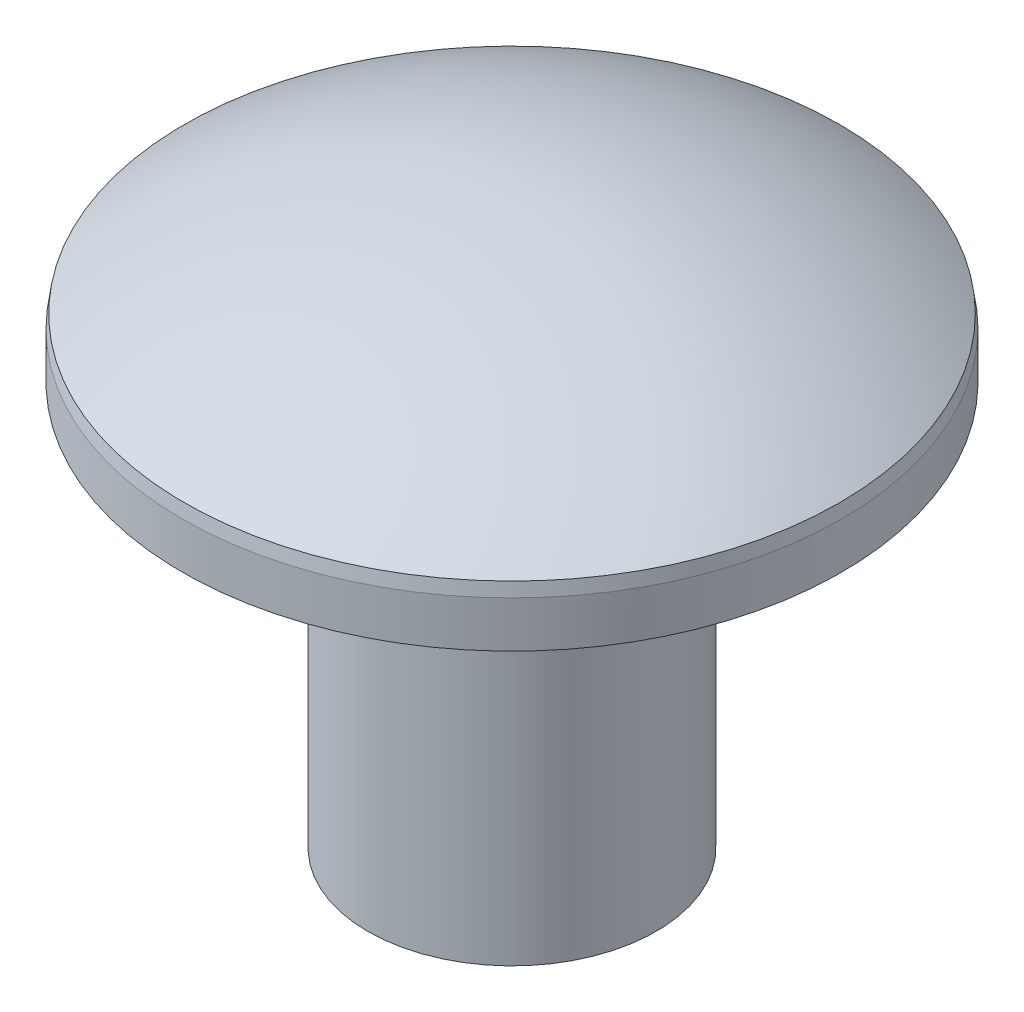
ISO-10303-21;
HEADER;
FILE_DESCRIPTION(('STEP AP214'),'2;1');
FILE_NAME('part.step','',(''),(''),'','','');
FILE_SCHEMA(('AUTOMOTIVE_DESIGN { 1 0 10303 214 1 1 1 1 }'));
ENDSEC;
DATA;
#1=APPLICATION_CONTEXT('core data for automotive mechanical design processes');
#2=APPLICATION_PROTOCOL_DEFINITION('international standard','automotive_design',2000,#1);
#3=PRODUCT_CONTEXT('',#1,'mechanical');
#4=PRODUCT('Part','Part','',(#3));
#5=PRODUCT_RELATED_PRODUCT_CATEGORY('part','',(#4));
#6=PRODUCT_DEFINITION_FORMATION('','',#4);
#7=PRODUCT_DEFINITION_CONTEXT('part definition',#1,'design');
#8=PRODUCT_DEFINITION('design','',#6,#7);
#9=PRODUCT_DEFINITION_SHAPE('','',#8);
#10=(LENGTH_UNIT() NAMED_UNIT(*) SI_UNIT(.MILLI.,.METRE.));
#11=(NAMED_UNIT(*) PLANE_ANGLE_UNIT() SI_UNIT($,.RADIAN.));
#12=(NAMED_UNIT(*) SI_UNIT($,.STERADIAN.) SOLID_ANGLE_UNIT());
#13=UNCERTAINTY_MEASURE_WITH_UNIT(LENGTH_MEASURE(1.E-05),#10,'distance_accuracy_value','');
#14=(GEOMETRIC_REPRESENTATION_CONTEXT(3) GLOBAL_UNCERTAINTY_ASSIGNED_CONTEXT((#13)) GLOBAL_UNIT_ASSIGNED_CONTEXT((#10,
#11,#12)) REPRESENTATION_CONTEXT('',''));
#15=CARTESIAN_POINT('',(0.,0.,0.));
#16=DIRECTION('',(0.,0.,1.));
#17=DIRECTION('',(1.,0.,0.));
#18=AXIS2_PLACEMENT_3D('',#15,#16,#17);
#19=CARTESIAN_POINT('',(0.,-40.,0.));
#20=DIRECTION('',(0.,-1.,0.));
#21=DIRECTION('',(1.,0.,0.));
#22=AXIS2_PLACEMENT_3D('',#19,#20,#21);
#23=SPHERICAL_SURFACE('',#22,50.);
#24=CARTESIAN_POINT('',(0.,1.14611396009206,0.));
#25=DIRECTION('',(0.,-1.,0.));
#26=DIRECTION('',(0.,0.,-1.));
#27=AXIS2_PLACEMENT_3D('',#24,#25,#26);
#28=CIRCLE('',#27,28.4076980057011);
#29=CARTESIAN_POINT('',(0.,1.14611396009206,-28.4076980057011));
#30=VERTEX_POINT('',#29);
#31=EDGE_CURVE('E50',#30,#30,#28,.F.);
#32=ORIENTED_EDGE('',*,*,#31,.T.);
#33=EDGE_LOOP('',(#32));
#34=FACE_BOUND('',#33,.T.);
#35=ADVANCED_FACE('F45',(#34),#23,.T.);
#36=CARTESIAN_POINT('',(0.,0.,0.));
#37=DIRECTION('',(0.,-1.,0.));
#38=DIRECTION('',(0.,0.,-1.));
#39=AXIS2_PLACEMENT_3D('',#36,#37,#38);
#40=CONICAL_SURFACE('',#39,28.5714285714287,0.141897054604244);
#41=ORIENTED_EDGE('',*,*,#31,.F.);
#42=EDGE_LOOP('',(#41));
#43=FACE_BOUND('',#42,.T.);
#44=CARTESIAN_POINT('',(0.,0.,0.));
#45=DIRECTION('',(0.,1.,0.));
#46=DIRECTION('',(0.,0.,1.));
#47=AXIS2_PLACEMENT_3D('',#44,#45,#46);
#48=CIRCLE('',#47,28.5714285714287);
#49=CARTESIAN_POINT('',(0.,0.,28.5714285714287));
#50=VERTEX_POINT('',#49);
#51=EDGE_CURVE('E60',#50,#50,#48,.F.);
#52=ORIENTED_EDGE('',*,*,#51,.F.);
#53=EDGE_LOOP('',(#52));
#54=FACE_BOUND('',#53,.T.);
#55=ADVANCED_FACE('F48',(#43,#54),#40,.T.);
#56=CARTESIAN_POINT('',(0.,-4.,0.));
#57=DIRECTION('',(0.,1.,0.));
#58=DIRECTION('',(0.,0.,1.));
#59=AXIS2_PLACEMENT_3D('',#56,#57,#58);
#60=CYLINDRICAL_SURFACE('',#59,28.5714285714287);
#61=CARTESIAN_POINT('',(0.,-4.,0.));
#62=DIRECTION('',(0.,-1.,0.));
#63=DIRECTION('',(0.,0.,-1.));
#64=AXIS2_PLACEMENT_3D('',#61,#62,#63);
#65=CIRCLE('',#64,28.5714285714287);
#66=CARTESIAN_POINT('',(0.,-4.,-28.5714285714287));
#67=VERTEX_POINT('',#66);
#68=EDGE_CURVE('E64',#67,#67,#65,.T.);
#69=ORIENTED_EDGE('',*,*,#68,.F.);
#70=EDGE_LOOP('',(#69));
#71=FACE_BOUND('',#70,.T.);
#72=ORIENTED_EDGE('',*,*,#51,.T.);
#73=EDGE_LOOP('',(#72));
#74=FACE_BOUND('',#73,.T.);
#75=ADVANCED_FACE('F71',(#71,#74),#60,.T.);
#76=CARTESIAN_POINT('',(0.,-4.,0.));
#77=DIRECTION('',(0.,-1.,0.));
#78=DIRECTION('',(0.,0.,-1.));
#79=AXIS2_PLACEMENT_3D('',#76,#77,#78);
#80=PLANE('',#79);
#81=CARTESIAN_POINT('',(0.,-4.,0.));
#82=DIRECTION('',(0.,-1.,0.));
#83=DIRECTION('',(0.,0.,-1.));
#84=AXIS2_PLACEMENT_3D('',#81,#82,#83);
#85=CIRCLE('',#84,12.5);
#86=CARTESIAN_POINT('',(0.,-4.,-12.5));
#87=VERTEX_POINT('',#86);
#88=EDGE_CURVE('E10',#87,#87,#85,.T.);
#89=ORIENTED_EDGE('',*,*,#88,.F.);
#90=EDGE_LOOP('',(#89));
#91=FACE_BOUND('',#90,.T.);
#92=ORIENTED_EDGE('',*,*,#68,.T.);
#93=EDGE_LOOP('',(#92));
#94=FACE_BOUND('',#93,.T.);
#95=ADVANCED_FACE('F79',(#91,#94),#80,.T.);
#96=CARTESIAN_POINT('',(0.,-39.,0.));
#97=DIRECTION('',(0.,1.,0.));
#98=DIRECTION('',(0.,0.,1.));
#99=AXIS2_PLACEMENT_3D('',#96,#97,#98);
#100=CYLINDRICAL_SURFACE('',#99,12.5);
#101=CARTESIAN_POINT('',(0.,-39.,0.));
#102=DIRECTION('',(0.,-1.,0.));
#103=DIRECTION('',(0.,0.,-1.));
#104=AXIS2_PLACEMENT_3D('',#101,#102,#103);
#105=CIRCLE('',#104,12.5);
#106=CARTESIAN_POINT('',(0.,-39.,-12.5));
#107=VERTEX_POINT('',#106);
#108=EDGE_CURVE('E63',#107,#107,#105,.T.);
#109=ORIENTED_EDGE('',*,*,#108,.F.);
#110=EDGE_LOOP('',(#109));
#111=FACE_BOUND('',#110,.T.);
#112=ORIENTED_EDGE('',*,*,#88,.T.);
#113=EDGE_LOOP('',(#112));
#114=FACE_BOUND('',#113,.T.);
#115=ADVANCED_FACE('F89',(#111,#114),#100,.T.);
#116=CARTESIAN_POINT('',(0.,-39.,0.));
#117=DIRECTION('',(0.,-1.,0.));
#118=DIRECTION('',(0.,0.,-1.));
#119=AXIS2_PLACEMENT_3D('',#116,#117,#118);
#120=PLANE('',#119);
#121=ORIENTED_EDGE('',*,*,#108,.T.);
#122=EDGE_LOOP('',(#121));
#123=FACE_BOUND('',#122,.T.);
#124=ADVANCED_FACE('F93',(#123),#120,.T.);
#125=CLOSED_SHELL('',(#35,#55,#75,#95,#115,#124));
#126=MANIFOLD_SOLID_BREP('B2',#125);
#127=ADVANCED_BREP_SHAPE_REPRESENTATION('',(#18,#126),#14);
#128=SHAPE_DEFINITION_REPRESENTATION(#9,#127);
ENDSEC;
END-ISO-10303-21;
